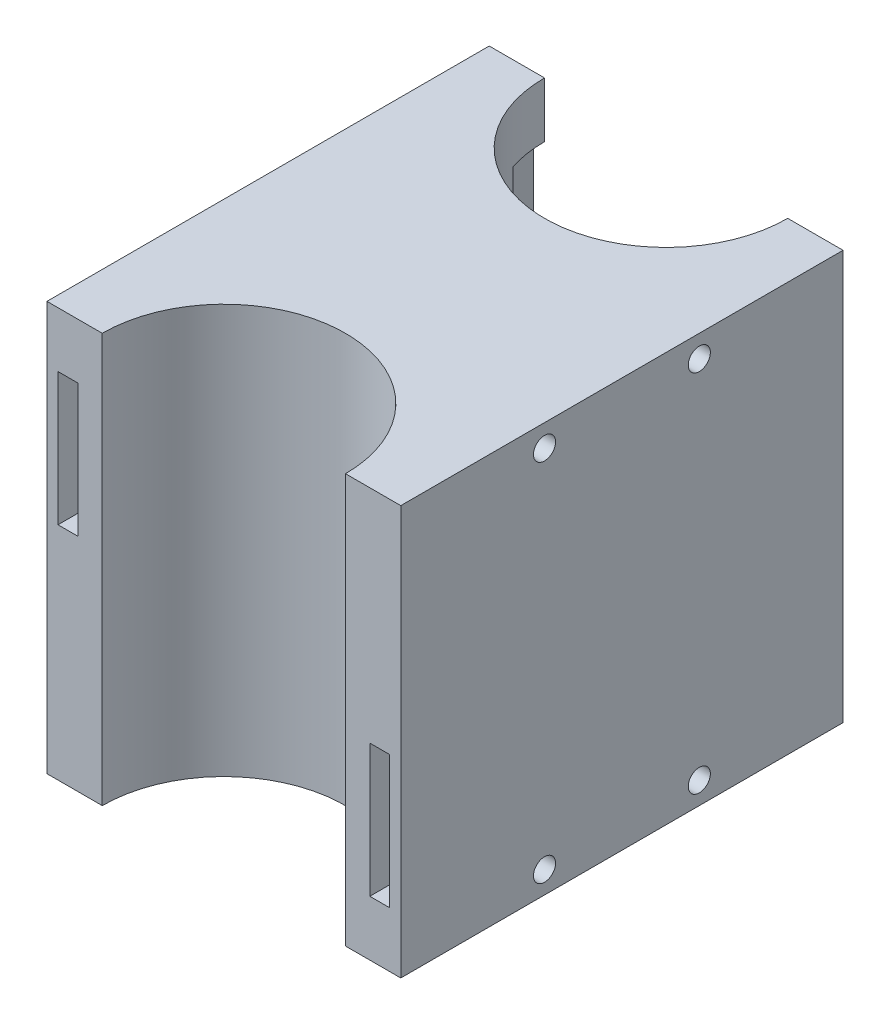
ISO-10303-21;
HEADER;
FILE_DESCRIPTION(('STEP AP214'),'2;1');
FILE_NAME('part.step','',(''),(''),'','','');
FILE_SCHEMA(('AUTOMOTIVE_DESIGN { 1 0 10303 214 1 1 1 1 }'));
ENDSEC;
DATA;
#1=APPLICATION_CONTEXT('core data for automotive mechanical design processes');
#2=APPLICATION_PROTOCOL_DEFINITION('international standard','automotive_design',2000,#1);
#3=PRODUCT_CONTEXT('',#1,'mechanical');
#4=PRODUCT('Part','Part','',(#3));
#5=PRODUCT_RELATED_PRODUCT_CATEGORY('part','',(#4));
#6=PRODUCT_DEFINITION_FORMATION('','',#4);
#7=PRODUCT_DEFINITION_CONTEXT('part definition',#1,'design');
#8=PRODUCT_DEFINITION('design','',#6,#7);
#9=PRODUCT_DEFINITION_SHAPE('','',#8);
#10=(LENGTH_UNIT() NAMED_UNIT(*) SI_UNIT(.MILLI.,.METRE.));
#11=(NAMED_UNIT(*) PLANE_ANGLE_UNIT() SI_UNIT($,.RADIAN.));
#12=(NAMED_UNIT(*) SI_UNIT($,.STERADIAN.) SOLID_ANGLE_UNIT());
#13=UNCERTAINTY_MEASURE_WITH_UNIT(LENGTH_MEASURE(1.E-05),#10,'distance_accuracy_value','');
#14=(GEOMETRIC_REPRESENTATION_CONTEXT(3) GLOBAL_UNCERTAINTY_ASSIGNED_CONTEXT((#13)) GLOBAL_UNIT_ASSIGNED_CONTEXT((#10,
#11,#12)) REPRESENTATION_CONTEXT('',''));
#15=CARTESIAN_POINT('',(0.,0.,0.));
#16=DIRECTION('',(0.,0.,1.));
#17=DIRECTION('',(1.,0.,0.));
#18=AXIS2_PLACEMENT_3D('',#15,#16,#17);
#19=CARTESIAN_POINT('',(0.,30.,-40.));
#20=DIRECTION('',(0.,-1.,0.));
#21=DIRECTION('',(0.,0.,-1.));
#22=AXIS2_PLACEMENT_3D('',#19,#20,#21);
#23=CYLINDRICAL_SURFACE('',#22,11.);
#24=DIRECTION('',(0.,-1.,0.));
#25=VECTOR('',#24,1.);
#26=CARTESIAN_POINT('',(-11.,30.,-40.));
#27=LINE('',#26,#25);
#28=CARTESIAN_POINT('',(-11.,33.5,-40.));
#29=VERTEX_POINT('',#28);
#30=CARTESIAN_POINT('',(-11.,28.5,-40.));
#31=VERTEX_POINT('',#30);
#32=EDGE_CURVE('E337',#29,#31,#27,.T.);
#33=ORIENTED_EDGE('',*,*,#32,.F.);
#34=CARTESIAN_POINT('',(0.,33.5,-40.));
#35=DIRECTION('',(0.,1.,0.));
#36=DIRECTION('',(0.,0.,1.));
#37=AXIS2_PLACEMENT_3D('',#34,#35,#36);
#38=CIRCLE('',#37,11.);
#39=CARTESIAN_POINT('',(11.,33.5,-40.));
#40=VERTEX_POINT('',#39);
#41=EDGE_CURVE('E202',#29,#40,#38,.T.);
#42=ORIENTED_EDGE('',*,*,#41,.T.);
#43=DIRECTION('',(0.,-1.,0.));
#44=VECTOR('',#43,1.);
#45=CARTESIAN_POINT('',(11.,30.,-40.));
#46=LINE('',#45,#44);
#47=CARTESIAN_POINT('',(11.,13.5,-40.));
#48=VERTEX_POINT('',#47);
#49=EDGE_CURVE('E251',#48,#40,#46,.F.);
#50=ORIENTED_EDGE('',*,*,#49,.F.);
#51=CARTESIAN_POINT('',(0.,13.5,-40.));
#52=DIRECTION('',(0.,-1.,0.));
#53=DIRECTION('',(0.,0.,-1.));
#54=AXIS2_PLACEMENT_3D('',#51,#52,#53);
#55=CIRCLE('',#54,11.);
#56=CARTESIAN_POINT('',(10.472424422504,13.5,-36.6342420296547));
#57=VERTEX_POINT('',#56);
#58=EDGE_CURVE('E43',#48,#57,#55,.T.);
#59=ORIENTED_EDGE('',*,*,#58,.T.);
#60=DIRECTION('',(0.,-1.,0.));
#61=VECTOR('',#60,1.);
#62=CARTESIAN_POINT('',(10.472424422504,30.,-36.6342420296548));
#63=LINE('',#62,#61);
#64=CARTESIAN_POINT('',(10.472424422504,1.5,-36.6342420296547));
#65=VERTEX_POINT('',#64);
#66=EDGE_CURVE('E244',#65,#57,#63,.F.);
#67=ORIENTED_EDGE('',*,*,#66,.F.);
#68=CARTESIAN_POINT('',(0.,1.5,-40.));
#69=DIRECTION('',(0.,-1.,0.));
#70=DIRECTION('',(0.,0.,-1.));
#71=AXIS2_PLACEMENT_3D('',#68,#69,#70);
#72=CIRCLE('',#71,11.);
#73=CARTESIAN_POINT('',(11.,1.5,-40.));
#74=VERTEX_POINT('',#73);
#75=EDGE_CURVE('E242',#74,#65,#72,.T.);
#76=ORIENTED_EDGE('',*,*,#75,.F.);
#77=CARTESIAN_POINT('',(11.,-3.50000000000001,-40.));
#78=VERTEX_POINT('',#77);
#79=EDGE_CURVE('E398',#78,#74,#46,.F.);
#80=ORIENTED_EDGE('',*,*,#79,.F.);
#81=CARTESIAN_POINT('',(0.,-3.50000000000001,-40.));
#82=DIRECTION('',(0.,-1.,0.));
#83=DIRECTION('',(0.,0.,-1.));
#84=AXIS2_PLACEMENT_3D('',#81,#82,#83);
#85=CIRCLE('',#84,11.);
#86=CARTESIAN_POINT('',(-11.,-3.50000000000001,-40.));
#87=VERTEX_POINT('',#86);
#88=EDGE_CURVE('E308',#78,#87,#85,.T.);
#89=ORIENTED_EDGE('',*,*,#88,.T.);
#90=CARTESIAN_POINT('',(-11.,16.5,-40.));
#91=VERTEX_POINT('',#90);
#92=EDGE_CURVE('E50',#91,#87,#27,.T.);
#93=ORIENTED_EDGE('',*,*,#92,.F.);
#94=CARTESIAN_POINT('',(0.,16.5,-40.));
#95=DIRECTION('',(0.,1.,0.));
#96=DIRECTION('',(0.,0.,1.));
#97=AXIS2_PLACEMENT_3D('',#94,#95,#96);
#98=CIRCLE('',#97,11.);
#99=CARTESIAN_POINT('',(-10.472424422504,16.5,-36.6342420296547));
#100=VERTEX_POINT('',#99);
#101=EDGE_CURVE('E240',#91,#100,#98,.T.);
#102=ORIENTED_EDGE('',*,*,#101,.T.);
#103=DIRECTION('',(0.,-1.,0.));
#104=VECTOR('',#103,1.);
#105=CARTESIAN_POINT('',(-10.472424422504,30.,-36.6342420296547));
#106=LINE('',#105,#104);
#107=CARTESIAN_POINT('',(-10.472424422504,28.5,-36.6342420296547));
#108=VERTEX_POINT('',#107);
#109=EDGE_CURVE('E237',#108,#100,#106,.T.);
#110=ORIENTED_EDGE('',*,*,#109,.F.);
#111=CARTESIAN_POINT('',(0.,28.5,-40.));
#112=DIRECTION('',(0.,1.,0.));
#113=DIRECTION('',(0.,0.,1.));
#114=AXIS2_PLACEMENT_3D('',#111,#112,#113);
#115=CIRCLE('',#114,11.);
#116=EDGE_CURVE('E232',#31,#108,#115,.T.);
#117=ORIENTED_EDGE('',*,*,#116,.F.);
#118=EDGE_LOOP('',(#33,#42,#50,#59,#67,#76,#80,#89,#93,#102,#110,#117));
#119=FACE_BOUND('',#118,.T.);
#120=ADVANCED_FACE('F35',(#119),#23,.F.);
#121=CARTESIAN_POINT('',(-16.,30.,-53.5));
#122=DIRECTION('',(1.,0.,0.));
#123=DIRECTION('',(0.,0.,-1.));
#124=AXIS2_PLACEMENT_3D('',#121,#122,#123);
#125=PLANE('',#124);
#126=CARTESIAN_POINT('',(-16.,-1.50000000000001,-13.));
#127=DIRECTION('',(1.,0.,0.));
#128=DIRECTION('',(0.,0.,-1.));
#129=AXIS2_PLACEMENT_3D('',#126,#127,#128);
#130=CIRCLE('',#129,1.);
#131=CARTESIAN_POINT('',(-16.,-1.50000000000001,-14.));
#132=VERTEX_POINT('',#131);
#133=EDGE_CURVE('E362',#132,#132,#130,.T.);
#134=ORIENTED_EDGE('',*,*,#133,.T.);
#135=EDGE_LOOP('',(#134));
#136=FACE_BOUND('',#135,.T.);
#137=CARTESIAN_POINT('',(-16.,-1.50000000000001,-27.));
#138=DIRECTION('',(1.,0.,0.));
#139=DIRECTION('',(0.,0.,-1.));
#140=AXIS2_PLACEMENT_3D('',#137,#138,#139);
#141=CIRCLE('',#140,1.);
#142=CARTESIAN_POINT('',(-16.,-1.50000000000001,-28.));
#143=VERTEX_POINT('',#142);
#144=EDGE_CURVE('E368',#143,#143,#141,.T.);
#145=ORIENTED_EDGE('',*,*,#144,.T.);
#146=EDGE_LOOP('',(#145));
#147=FACE_BOUND('',#146,.T.);
#148=CARTESIAN_POINT('',(-16.,31.5,-27.));
#149=DIRECTION('',(1.,0.,0.));
#150=DIRECTION('',(0.,0.,-1.));
#151=AXIS2_PLACEMENT_3D('',#148,#149,#150);
#152=CIRCLE('',#151,1.);
#153=CARTESIAN_POINT('',(-16.,31.5,-28.));
#154=VERTEX_POINT('',#153);
#155=EDGE_CURVE('E374',#154,#154,#152,.T.);
#156=ORIENTED_EDGE('',*,*,#155,.T.);
#157=EDGE_LOOP('',(#156));
#158=FACE_BOUND('',#157,.T.);
#159=CARTESIAN_POINT('',(-16.,31.5,-13.));
#160=DIRECTION('',(1.,0.,0.));
#161=DIRECTION('',(0.,0.,-1.));
#162=AXIS2_PLACEMENT_3D('',#159,#160,#161);
#163=CIRCLE('',#162,1.);
#164=CARTESIAN_POINT('',(-16.,31.5,-14.));
#165=VERTEX_POINT('',#164);
#166=EDGE_CURVE('E380',#165,#165,#163,.T.);
#167=ORIENTED_EDGE('',*,*,#166,.T.);
#168=EDGE_LOOP('',(#167));
#169=FACE_BOUND('',#168,.T.);
#170=DIRECTION('',(0.,0.,1.));
#171=VECTOR('',#170,1.);
#172=CARTESIAN_POINT('',(-16.,33.5,-53.5));
#173=LINE('',#172,#171);
#174=CARTESIAN_POINT('',(-16.,33.5,-40.));
#175=VERTEX_POINT('',#174);
#176=CARTESIAN_POINT('',(-16.,33.5,0.));
#177=VERTEX_POINT('',#176);
#178=EDGE_CURVE('E198',#175,#177,#173,.T.);
#179=ORIENTED_EDGE('',*,*,#178,.F.);
#180=DIRECTION('',(0.,-1.,0.));
#181=VECTOR('',#180,1.);
#182=CARTESIAN_POINT('',(-16.,-3.50000000000001,-40.));
#183=LINE('',#182,#181);
#184=CARTESIAN_POINT('',(-16.,-3.50000000000001,-40.));
#185=VERTEX_POINT('',#184);
#186=EDGE_CURVE('E182',#175,#185,#183,.T.);
#187=ORIENTED_EDGE('',*,*,#186,.T.);
#188=DIRECTION('',(0.,0.,-1.));
#189=VECTOR('',#188,1.);
#190=CARTESIAN_POINT('',(-16.,-3.50000000000001,-26.5));
#191=LINE('',#190,#189);
#192=CARTESIAN_POINT('',(-16.,-3.50000000000001,0.));
#193=VERTEX_POINT('',#192);
#194=EDGE_CURVE('E311',#193,#185,#191,.T.);
#195=ORIENTED_EDGE('',*,*,#194,.F.);
#196=DIRECTION('',(0.,1.,0.));
#197=VECTOR('',#196,1.);
#198=CARTESIAN_POINT('',(-16.,33.5,0.));
#199=LINE('',#198,#197);
#200=EDGE_CURVE('E206',#193,#177,#199,.T.);
#201=ORIENTED_EDGE('',*,*,#200,.T.);
#202=EDGE_LOOP('',(#179,#187,#195,#201));
#203=FACE_BOUND('',#202,.T.);
#204=ADVANCED_FACE('F37',(#136,#147,#158,#169,#203),#125,.F.);
#205=CARTESIAN_POINT('',(16.,30.,-53.5));
#206=DIRECTION('',(-1.,0.,0.));
#207=DIRECTION('',(0.,0.,1.));
#208=AXIS2_PLACEMENT_3D('',#205,#206,#207);
#209=PLANE('',#208);
#210=CARTESIAN_POINT('',(16.,-1.50000000000001,-13.));
#211=DIRECTION('',(1.,0.,0.));
#212=DIRECTION('',(0.,0.,-1.));
#213=AXIS2_PLACEMENT_3D('',#210,#211,#212);
#214=CIRCLE('',#213,1.);
#215=CARTESIAN_POINT('',(16.,-1.50000000000001,-14.));
#216=VERTEX_POINT('',#215);
#217=EDGE_CURVE('E361',#216,#216,#214,.T.);
#218=ORIENTED_EDGE('',*,*,#217,.F.);
#219=EDGE_LOOP('',(#218));
#220=FACE_BOUND('',#219,.T.);
#221=CARTESIAN_POINT('',(16.,-1.50000000000001,-27.));
#222=DIRECTION('',(1.,0.,0.));
#223=DIRECTION('',(0.,0.,-1.));
#224=AXIS2_PLACEMENT_3D('',#221,#222,#223);
#225=CIRCLE('',#224,1.);
#226=CARTESIAN_POINT('',(16.,-1.50000000000001,-28.));
#227=VERTEX_POINT('',#226);
#228=EDGE_CURVE('E365',#227,#227,#225,.T.);
#229=ORIENTED_EDGE('',*,*,#228,.F.);
#230=EDGE_LOOP('',(#229));
#231=FACE_BOUND('',#230,.T.);
#232=CARTESIAN_POINT('',(16.,31.5,-27.));
#233=DIRECTION('',(1.,0.,0.));
#234=DIRECTION('',(0.,0.,-1.));
#235=AXIS2_PLACEMENT_3D('',#232,#233,#234);
#236=CIRCLE('',#235,1.);
#237=CARTESIAN_POINT('',(16.,31.5,-28.));
#238=VERTEX_POINT('',#237);
#239=EDGE_CURVE('E371',#238,#238,#236,.T.);
#240=ORIENTED_EDGE('',*,*,#239,.F.);
#241=EDGE_LOOP('',(#240));
#242=FACE_BOUND('',#241,.T.);
#243=CARTESIAN_POINT('',(16.,31.5,-13.));
#244=DIRECTION('',(1.,0.,0.));
#245=DIRECTION('',(0.,0.,-1.));
#246=AXIS2_PLACEMENT_3D('',#243,#244,#245);
#247=CIRCLE('',#246,1.);
#248=CARTESIAN_POINT('',(16.,31.5,-14.));
#249=VERTEX_POINT('',#248);
#250=EDGE_CURVE('E377',#249,#249,#247,.T.);
#251=ORIENTED_EDGE('',*,*,#250,.F.);
#252=EDGE_LOOP('',(#251));
#253=FACE_BOUND('',#252,.T.);
#254=DIRECTION('',(0.,0.,1.));
#255=VECTOR('',#254,1.);
#256=CARTESIAN_POINT('',(16.,-3.50000000000001,-53.5));
#257=LINE('',#256,#255);
#258=CARTESIAN_POINT('',(16.,-3.50000000000001,-40.));
#259=VERTEX_POINT('',#258);
#260=CARTESIAN_POINT('',(16.,-3.50000000000001,0.));
#261=VERTEX_POINT('',#260);
#262=EDGE_CURVE('E212',#259,#261,#257,.T.);
#263=ORIENTED_EDGE('',*,*,#262,.F.);
#264=DIRECTION('',(0.,-1.,0.));
#265=VECTOR('',#264,1.);
#266=CARTESIAN_POINT('',(16.,-3.50000000000001,-40.));
#267=LINE('',#266,#265);
#268=CARTESIAN_POINT('',(16.,33.5,-40.));
#269=VERTEX_POINT('',#268);
#270=EDGE_CURVE('E58',#269,#259,#267,.T.);
#271=ORIENTED_EDGE('',*,*,#270,.F.);
#272=DIRECTION('',(0.,0.,-1.));
#273=VECTOR('',#272,1.);
#274=CARTESIAN_POINT('',(16.,33.5,-26.5));
#275=LINE('',#274,#273);
#276=CARTESIAN_POINT('',(16.,33.5,0.));
#277=VERTEX_POINT('',#276);
#278=EDGE_CURVE('E207',#277,#269,#275,.T.);
#279=ORIENTED_EDGE('',*,*,#278,.F.);
#280=DIRECTION('',(0.,1.,0.));
#281=VECTOR('',#280,1.);
#282=CARTESIAN_POINT('',(16.,33.5,0.));
#283=LINE('',#282,#281);
#284=EDGE_CURVE('E327',#261,#277,#283,.T.);
#285=ORIENTED_EDGE('',*,*,#284,.F.);
#286=EDGE_LOOP('',(#263,#271,#279,#285));
#287=FACE_BOUND('',#286,.T.);
#288=ADVANCED_FACE('F332',(#220,#231,#242,#253,#287),#209,.F.);
#289=CARTESIAN_POINT('',(24.9601132838557,16.5,-24.7141258886984));
#290=DIRECTION('',(0.,1.,0.));
#291=DIRECTION('',(0.,0.,1.));
#292=AXIS2_PLACEMENT_3D('',#289,#290,#291);
#293=CYLINDRICAL_SURFACE('',#292,40.);
#294=CARTESIAN_POINT('',(24.9601132838557,16.5,-24.7141258886984));
#295=DIRECTION('',(0.,1.,0.));
#296=DIRECTION('',(0.,0.,1.));
#297=AXIS2_PLACEMENT_3D('',#294,#295,#296);
#298=CIRCLE('',#297,40.);
#299=CARTESIAN_POINT('',(-12.0039510577915,16.5,-40.));
#300=VERTEX_POINT('',#299);
#301=CARTESIAN_POINT('',(-15.,16.5,-26.5));
#302=VERTEX_POINT('',#301);
#303=EDGE_CURVE('E226',#300,#302,#298,.T.);
#304=ORIENTED_EDGE('',*,*,#303,.F.);
#305=DIRECTION('',(0.,1.,0.));
#306=VECTOR('',#305,1.);
#307=CARTESIAN_POINT('',(-12.0039510577915,16.5,-40.));
#308=LINE('',#307,#306);
#309=CARTESIAN_POINT('',(-12.0039510577915,28.5,-40.));
#310=VERTEX_POINT('',#309);
#311=EDGE_CURVE('E408',#300,#310,#308,.T.);
#312=ORIENTED_EDGE('',*,*,#311,.T.);
#313=CARTESIAN_POINT('',(24.9601132838557,28.5,-24.7141258886984));
#314=DIRECTION('',(0.,1.,0.));
#315=DIRECTION('',(0.,0.,1.));
#316=AXIS2_PLACEMENT_3D('',#313,#314,#315);
#317=CIRCLE('',#316,40.);
#318=CARTESIAN_POINT('',(-15.,28.5,-26.5));
#319=VERTEX_POINT('',#318);
#320=EDGE_CURVE('E222',#310,#319,#317,.T.);
#321=ORIENTED_EDGE('',*,*,#320,.T.);
#322=DIRECTION('',(0.,1.,0.));
#323=VECTOR('',#322,1.);
#324=CARTESIAN_POINT('',(-15.,28.5,-26.5));
#325=LINE('',#324,#323);
#326=EDGE_CURVE('E275',#302,#319,#325,.T.);
#327=ORIENTED_EDGE('',*,*,#326,.F.);
#328=EDGE_LOOP('',(#304,#312,#321,#327));
#329=FACE_BOUND('',#328,.T.);
#330=ADVANCED_FACE('F422',(#329),#293,.F.);
#331=CARTESIAN_POINT('',(-13.2,16.5,-26.5));
#332=DIRECTION('',(0.965636665998328,0.,0.259895804659548));
#333=DIRECTION('',(0.259895804659548,0.,-0.965636665998328));
#334=AXIS2_PLACEMENT_3D('',#331,#332,#333);
#335=PLANE('',#334);
#336=ORIENTED_EDGE('',*,*,#109,.T.);
#337=DIRECTION('',(0.259895804659548,0.,-0.965636665998328));
#338=VECTOR('',#337,1.);
#339=CARTESIAN_POINT('',(-13.2,16.5,-26.5));
#340=LINE('',#339,#338);
#341=CARTESIAN_POINT('',(-13.2,16.5,-26.5));
#342=VERTEX_POINT('',#341);
#343=EDGE_CURVE('E228',#342,#100,#340,.T.);
#344=ORIENTED_EDGE('',*,*,#343,.F.);
#345=DIRECTION('',(0.,-1.,0.));
#346=VECTOR('',#345,1.);
#347=CARTESIAN_POINT('',(-13.2,16.5,-26.5));
#348=LINE('',#347,#346);
#349=CARTESIAN_POINT('',(-13.2,28.5,-26.5));
#350=VERTEX_POINT('',#349);
#351=EDGE_CURVE('E279',#350,#342,#348,.T.);
#352=ORIENTED_EDGE('',*,*,#351,.F.);
#353=DIRECTION('',(0.259895804659548,0.,-0.965636665998328));
#354=VECTOR('',#353,1.);
#355=CARTESIAN_POINT('',(-13.2,28.5,-26.5));
#356=LINE('',#355,#354);
#357=EDGE_CURVE('E229',#350,#108,#356,.T.);
#358=ORIENTED_EDGE('',*,*,#357,.T.);
#359=EDGE_LOOP('',(#336,#344,#352,#358));
#360=FACE_BOUND('',#359,.T.);
#361=ADVANCED_FACE('F433',(#360),#335,.F.);
#362=CARTESIAN_POINT('',(24.9601132838557,16.5,-24.7141258886984));
#363=DIRECTION('',(0.,1.,0.));
#364=DIRECTION('',(0.,0.,1.));
#365=AXIS2_PLACEMENT_3D('',#362,#363,#364);
#366=PLANE('',#365);
#367=DIRECTION('',(1.,0.,0.));
#368=VECTOR('',#367,1.);
#369=CARTESIAN_POINT('',(24.9601132838557,16.5,-40.));
#370=LINE('',#369,#368);
#371=EDGE_CURVE('E335',#300,#91,#370,.T.);
#372=ORIENTED_EDGE('',*,*,#371,.F.);
#373=ORIENTED_EDGE('',*,*,#303,.T.);
#374=DIRECTION('',(0.,0.,1.));
#375=VECTOR('',#374,1.);
#376=CARTESIAN_POINT('',(-15.,16.5,-13.5));
#377=LINE('',#376,#375);
#378=CARTESIAN_POINT('',(-15.,16.5,0.));
#379=VERTEX_POINT('',#378);
#380=EDGE_CURVE('E268',#302,#379,#377,.T.);
#381=ORIENTED_EDGE('',*,*,#380,.T.);
#382=DIRECTION('',(-1.,0.,0.));
#383=VECTOR('',#382,1.);
#384=CARTESIAN_POINT('',(24.9601132838557,16.5,0.));
#385=LINE('',#384,#383);
#386=CARTESIAN_POINT('',(-13.2,16.5,0.));
#387=VERTEX_POINT('',#386);
#388=EDGE_CURVE('E356',#387,#379,#385,.T.);
#389=ORIENTED_EDGE('',*,*,#388,.F.);
#390=DIRECTION('',(0.,0.,1.));
#391=VECTOR('',#390,1.);
#392=CARTESIAN_POINT('',(-13.2,16.5,-13.5));
#393=LINE('',#392,#391);
#394=EDGE_CURVE('E300',#342,#387,#393,.T.);
#395=ORIENTED_EDGE('',*,*,#394,.F.);
#396=ORIENTED_EDGE('',*,*,#343,.T.);
#397=ORIENTED_EDGE('',*,*,#101,.F.);
#398=EDGE_LOOP('',(#372,#373,#381,#389,#395,#396,#397));
#399=FACE_BOUND('',#398,.T.);
#400=ADVANCED_FACE('F418',(#399),#366,.T.);
#401=CARTESIAN_POINT('',(24.9601132838557,28.5,-24.7141258886984));
#402=DIRECTION('',(0.,1.,0.));
#403=DIRECTION('',(0.,0.,1.));
#404=AXIS2_PLACEMENT_3D('',#401,#402,#403);
#405=PLANE('',#404);
#406=ORIENTED_EDGE('',*,*,#320,.F.);
#407=DIRECTION('',(1.,0.,0.));
#408=VECTOR('',#407,1.);
#409=CARTESIAN_POINT('',(24.9601132838557,28.5,-40.));
#410=LINE('',#409,#408);
#411=EDGE_CURVE('E406',#310,#31,#410,.T.);
#412=ORIENTED_EDGE('',*,*,#411,.T.);
#413=ORIENTED_EDGE('',*,*,#116,.T.);
#414=ORIENTED_EDGE('',*,*,#357,.F.);
#415=DIRECTION('',(0.,0.,1.));
#416=VECTOR('',#415,1.);
#417=CARTESIAN_POINT('',(-13.2,28.5,-13.5));
#418=LINE('',#417,#416);
#419=CARTESIAN_POINT('',(-13.2,28.5,0.));
#420=VERTEX_POINT('',#419);
#421=EDGE_CURVE('E297',#350,#420,#418,.T.);
#422=ORIENTED_EDGE('',*,*,#421,.T.);
#423=DIRECTION('',(-1.,0.,0.));
#424=VECTOR('',#423,1.);
#425=CARTESIAN_POINT('',(24.9601132838557,28.5,0.));
#426=LINE('',#425,#424);
#427=CARTESIAN_POINT('',(-15.,28.5,0.));
#428=VERTEX_POINT('',#427);
#429=EDGE_CURVE('E353',#420,#428,#426,.T.);
#430=ORIENTED_EDGE('',*,*,#429,.T.);
#431=DIRECTION('',(0.,0.,1.));
#432=VECTOR('',#431,1.);
#433=CARTESIAN_POINT('',(-15.,28.5,-13.5));
#434=LINE('',#433,#432);
#435=EDGE_CURVE('E293',#319,#428,#434,.T.);
#436=ORIENTED_EDGE('',*,*,#435,.F.);
#437=EDGE_LOOP('',(#406,#412,#413,#414,#422,#430,#436));
#438=FACE_BOUND('',#437,.T.);
#439=ADVANCED_FACE('F435',(#438),#405,.F.);
#440=CARTESIAN_POINT('',(-24.9601132838557,13.5,-24.7141258886984));
#441=DIRECTION('',(0.,-1.,0.));
#442=DIRECTION('',(0.,0.,-1.));
#443=AXIS2_PLACEMENT_3D('',#440,#441,#442);
#444=CYLINDRICAL_SURFACE('',#443,40.);
#445=CARTESIAN_POINT('',(-24.9601132838557,13.5,-24.7141258886984));
#446=DIRECTION('',(0.,-1.,0.));
#447=DIRECTION('',(0.,0.,1.));
#448=AXIS2_PLACEMENT_3D('',#445,#446,#447);
#449=CIRCLE('',#448,40.);
#450=CARTESIAN_POINT('',(12.0039510577915,13.5,-40.));
#451=VERTEX_POINT('',#450);
#452=CARTESIAN_POINT('',(15.,13.5,-26.5));
#453=VERTEX_POINT('',#452);
#454=EDGE_CURVE('E216',#451,#453,#449,.T.);
#455=ORIENTED_EDGE('',*,*,#454,.F.);
#456=DIRECTION('',(0.,-1.,0.));
#457=VECTOR('',#456,1.);
#458=CARTESIAN_POINT('',(12.0039510577915,13.5,-40.));
#459=LINE('',#458,#457);
#460=CARTESIAN_POINT('',(12.0039510577915,1.5,-40.));
#461=VERTEX_POINT('',#460);
#462=EDGE_CURVE('E401',#451,#461,#459,.T.);
#463=ORIENTED_EDGE('',*,*,#462,.T.);
#464=CARTESIAN_POINT('',(-24.9601132838557,1.5,-24.7141258886984));
#465=DIRECTION('',(0.,-1.,0.));
#466=DIRECTION('',(0.,0.,1.));
#467=AXIS2_PLACEMENT_3D('',#464,#465,#466);
#468=CIRCLE('',#467,40.);
#469=CARTESIAN_POINT('',(15.,1.5,-26.5));
#470=VERTEX_POINT('',#469);
#471=EDGE_CURVE('E210',#461,#470,#468,.T.);
#472=ORIENTED_EDGE('',*,*,#471,.T.);
#473=DIRECTION('',(0.,-1.,0.));
#474=VECTOR('',#473,1.);
#475=CARTESIAN_POINT('',(15.,1.5,-26.5));
#476=LINE('',#475,#474);
#477=EDGE_CURVE('E276',#453,#470,#476,.T.);
#478=ORIENTED_EDGE('',*,*,#477,.F.);
#479=EDGE_LOOP('',(#455,#463,#472,#478));
#480=FACE_BOUND('',#479,.T.);
#481=ADVANCED_FACE('F708',(#480),#444,.F.);
#482=CARTESIAN_POINT('',(13.2,13.5,-26.5));
#483=DIRECTION('',(-0.965636665998328,0.,0.259895804659549));
#484=DIRECTION('',(0.259895804659549,0.,0.965636665998328));
#485=AXIS2_PLACEMENT_3D('',#482,#483,#484);
#486=PLANE('',#485);
#487=ORIENTED_EDGE('',*,*,#66,.T.);
#488=DIRECTION('',(-0.259895804659549,0.,-0.965636665998328));
#489=VECTOR('',#488,1.);
#490=CARTESIAN_POINT('',(13.2,13.5,-26.5));
#491=LINE('',#490,#489);
#492=CARTESIAN_POINT('',(13.2,13.5,-26.5));
#493=VERTEX_POINT('',#492);
#494=EDGE_CURVE('E218',#493,#57,#491,.T.);
#495=ORIENTED_EDGE('',*,*,#494,.F.);
#496=DIRECTION('',(0.,1.,0.));
#497=VECTOR('',#496,1.);
#498=CARTESIAN_POINT('',(13.2,13.5,-26.5));
#499=LINE('',#498,#497);
#500=CARTESIAN_POINT('',(13.2,1.5,-26.5));
#501=VERTEX_POINT('',#500);
#502=EDGE_CURVE('E271',#501,#493,#499,.T.);
#503=ORIENTED_EDGE('',*,*,#502,.F.);
#504=DIRECTION('',(-0.259895804659549,0.,-0.965636665998328));
#505=VECTOR('',#504,1.);
#506=CARTESIAN_POINT('',(13.2,1.5,-26.5));
#507=LINE('',#506,#505);
#508=EDGE_CURVE('E219',#501,#65,#507,.T.);
#509=ORIENTED_EDGE('',*,*,#508,.T.);
#510=EDGE_LOOP('',(#487,#495,#503,#509));
#511=FACE_BOUND('',#510,.T.);
#512=ADVANCED_FACE('F256',(#511),#486,.F.);
#513=CARTESIAN_POINT('',(-24.9601132838557,13.5,-24.7141258886984));
#514=DIRECTION('',(0.,-1.,0.));
#515=DIRECTION('',(0.,0.,1.));
#516=AXIS2_PLACEMENT_3D('',#513,#514,#515);
#517=PLANE('',#516);
#518=DIRECTION('',(-1.,0.,0.));
#519=VECTOR('',#518,1.);
#520=CARTESIAN_POINT('',(-24.9601132838557,13.5,-40.));
#521=LINE('',#520,#519);
#522=EDGE_CURVE('E400',#451,#48,#521,.T.);
#523=ORIENTED_EDGE('',*,*,#522,.F.);
#524=ORIENTED_EDGE('',*,*,#454,.T.);
#525=DIRECTION('',(0.,0.,1.));
#526=VECTOR('',#525,1.);
#527=CARTESIAN_POINT('',(15.,13.5,-13.5));
#528=LINE('',#527,#526);
#529=CARTESIAN_POINT('',(15.,13.5,0.));
#530=VERTEX_POINT('',#529);
#531=EDGE_CURVE('E269',#453,#530,#528,.T.);
#532=ORIENTED_EDGE('',*,*,#531,.T.);
#533=DIRECTION('',(1.,0.,0.));
#534=VECTOR('',#533,1.);
#535=CARTESIAN_POINT('',(-24.9601132838557,13.5,0.));
#536=LINE('',#535,#534);
#537=CARTESIAN_POINT('',(13.2,13.5,0.));
#538=VERTEX_POINT('',#537);
#539=EDGE_CURVE('E265',#538,#530,#536,.T.);
#540=ORIENTED_EDGE('',*,*,#539,.F.);
#541=DIRECTION('',(0.,0.,1.));
#542=VECTOR('',#541,1.);
#543=CARTESIAN_POINT('',(13.2,13.5,-13.5));
#544=LINE('',#543,#542);
#545=EDGE_CURVE('E262',#493,#538,#544,.T.);
#546=ORIENTED_EDGE('',*,*,#545,.F.);
#547=ORIENTED_EDGE('',*,*,#494,.T.);
#548=ORIENTED_EDGE('',*,*,#58,.F.);
#549=EDGE_LOOP('',(#523,#524,#532,#540,#546,#547,#548));
#550=FACE_BOUND('',#549,.T.);
#551=ADVANCED_FACE('F259',(#550),#517,.T.);
#552=CARTESIAN_POINT('',(-24.9601132838557,1.5,-24.7141258886984));
#553=DIRECTION('',(0.,-1.,0.));
#554=DIRECTION('',(0.,0.,1.));
#555=AXIS2_PLACEMENT_3D('',#552,#553,#554);
#556=PLANE('',#555);
#557=ORIENTED_EDGE('',*,*,#471,.F.);
#558=DIRECTION('',(-1.,0.,0.));
#559=VECTOR('',#558,1.);
#560=CARTESIAN_POINT('',(-24.9601132838557,1.5,-40.));
#561=LINE('',#560,#559);
#562=EDGE_CURVE('E394',#461,#74,#561,.T.);
#563=ORIENTED_EDGE('',*,*,#562,.T.);
#564=ORIENTED_EDGE('',*,*,#75,.T.);
#565=ORIENTED_EDGE('',*,*,#508,.F.);
#566=DIRECTION('',(0.,0.,1.));
#567=VECTOR('',#566,1.);
#568=CARTESIAN_POINT('',(13.2,1.5,-13.5));
#569=LINE('',#568,#567);
#570=CARTESIAN_POINT('',(13.2,1.5,0.));
#571=VERTEX_POINT('',#570);
#572=EDGE_CURVE('E274',#501,#571,#569,.T.);
#573=ORIENTED_EDGE('',*,*,#572,.T.);
#574=DIRECTION('',(1.,0.,0.));
#575=VECTOR('',#574,1.);
#576=CARTESIAN_POINT('',(-24.9601132838557,1.5,0.));
#577=LINE('',#576,#575);
#578=CARTESIAN_POINT('',(15.,1.5,0.));
#579=VERTEX_POINT('',#578);
#580=EDGE_CURVE('E341',#571,#579,#577,.T.);
#581=ORIENTED_EDGE('',*,*,#580,.T.);
#582=DIRECTION('',(0.,0.,1.));
#583=VECTOR('',#582,1.);
#584=CARTESIAN_POINT('',(15.,1.5,-13.5));
#585=LINE('',#584,#583);
#586=EDGE_CURVE('E289',#470,#579,#585,.T.);
#587=ORIENTED_EDGE('',*,*,#586,.F.);
#588=EDGE_LOOP('',(#557,#563,#564,#565,#573,#581,#587));
#589=FACE_BOUND('',#588,.T.);
#590=ADVANCED_FACE('F594',(#589),#556,.F.);
#591=CARTESIAN_POINT('',(0.,33.5,-40.));
#592=DIRECTION('',(0.,1.,0.));
#593=DIRECTION('',(0.,0.,1.));
#594=AXIS2_PLACEMENT_3D('',#591,#592,#593);
#595=PLANE('',#594);
#596=DIRECTION('',(1.,0.,0.));
#597=VECTOR('',#596,1.);
#598=CARTESIAN_POINT('',(-16.,33.5,-40.));
#599=LINE('',#598,#597);
#600=EDGE_CURVE('E185',#175,#29,#599,.T.);
#601=ORIENTED_EDGE('',*,*,#600,.F.);
#602=ORIENTED_EDGE('',*,*,#178,.T.);
#603=DIRECTION('',(1.,0.,0.));
#604=VECTOR('',#603,1.);
#605=CARTESIAN_POINT('',(-16.,33.5,0.));
#606=LINE('',#605,#604);
#607=CARTESIAN_POINT('',(-11.,33.5,0.));
#608=VERTEX_POINT('',#607);
#609=EDGE_CURVE('E340',#177,#608,#606,.T.);
#610=ORIENTED_EDGE('',*,*,#609,.T.);
#611=CARTESIAN_POINT('',(0.,33.5,0.));
#612=DIRECTION('',(0.,1.,0.));
#613=DIRECTION('',(0.,0.,1.));
#614=AXIS2_PLACEMENT_3D('',#611,#612,#613);
#615=CIRCLE('',#614,11.);
#616=CARTESIAN_POINT('',(11.,33.5,0.));
#617=VERTEX_POINT('',#616);
#618=EDGE_CURVE('E282',#617,#608,#615,.T.);
#619=ORIENTED_EDGE('',*,*,#618,.F.);
#620=EDGE_CURVE('E342',#617,#277,#606,.T.);
#621=ORIENTED_EDGE('',*,*,#620,.T.);
#622=ORIENTED_EDGE('',*,*,#278,.T.);
#623=EDGE_CURVE('E192',#40,#269,#599,.T.);
#624=ORIENTED_EDGE('',*,*,#623,.F.);
#625=ORIENTED_EDGE('',*,*,#41,.F.);
#626=EDGE_LOOP('',(#601,#602,#610,#619,#621,#622,#624,#625));
#627=FACE_BOUND('',#626,.T.);
#628=ADVANCED_FACE('F196',(#627),#595,.T.);
#629=CARTESIAN_POINT('',(0.,-3.50000000000001,-40.));
#630=DIRECTION('',(0.,-1.,0.));
#631=DIRECTION('',(0.,0.,-1.));
#632=AXIS2_PLACEMENT_3D('',#629,#630,#631);
#633=PLANE('',#632);
#634=DIRECTION('',(1.,0.,0.));
#635=VECTOR('',#634,1.);
#636=CARTESIAN_POINT('',(-16.,-3.50000000000001,-40.));
#637=LINE('',#636,#635);
#638=EDGE_CURVE('E203',#78,#259,#637,.T.);
#639=ORIENTED_EDGE('',*,*,#638,.T.);
#640=ORIENTED_EDGE('',*,*,#262,.T.);
#641=DIRECTION('',(1.,0.,0.));
#642=VECTOR('',#641,1.);
#643=CARTESIAN_POINT('',(-16.,-3.50000000000001,0.));
#644=LINE('',#643,#642);
#645=CARTESIAN_POINT('',(11.,-3.50000000000001,0.));
#646=VERTEX_POINT('',#645);
#647=EDGE_CURVE('E318',#646,#261,#644,.T.);
#648=ORIENTED_EDGE('',*,*,#647,.F.);
#649=CARTESIAN_POINT('',(0.,-3.5,0.));
#650=DIRECTION('',(0.,-1.,0.));
#651=DIRECTION('',(0.,0.,-1.));
#652=AXIS2_PLACEMENT_3D('',#649,#650,#651);
#653=CIRCLE('',#652,11.);
#654=CARTESIAN_POINT('',(-11.,-3.50000000000001,0.));
#655=VERTEX_POINT('',#654);
#656=EDGE_CURVE('E383',#655,#646,#653,.T.);
#657=ORIENTED_EDGE('',*,*,#656,.F.);
#658=EDGE_CURVE('E329',#193,#655,#644,.T.);
#659=ORIENTED_EDGE('',*,*,#658,.F.);
#660=ORIENTED_EDGE('',*,*,#194,.T.);
#661=EDGE_CURVE('E187',#185,#87,#637,.T.);
#662=ORIENTED_EDGE('',*,*,#661,.T.);
#663=ORIENTED_EDGE('',*,*,#88,.F.);
#664=EDGE_LOOP('',(#639,#640,#648,#657,#659,#660,#662,#663));
#665=FACE_BOUND('',#664,.T.);
#666=ADVANCED_FACE('F316',(#665),#633,.T.);
#667=CARTESIAN_POINT('',(0.,30.,0.));
#668=DIRECTION('',(0.,-1.,0.));
#669=DIRECTION('',(0.,0.,-1.));
#670=AXIS2_PLACEMENT_3D('',#667,#668,#669);
#671=CYLINDRICAL_SURFACE('',#670,11.);
#672=DIRECTION('',(0.,-1.,0.));
#673=VECTOR('',#672,1.);
#674=CARTESIAN_POINT('',(11.,30.,0.));
#675=LINE('',#674,#673);
#676=EDGE_CURVE('E306',#646,#617,#675,.F.);
#677=ORIENTED_EDGE('',*,*,#676,.T.);
#678=ORIENTED_EDGE('',*,*,#618,.T.);
#679=DIRECTION('',(0.,-1.,0.));
#680=VECTOR('',#679,1.);
#681=CARTESIAN_POINT('',(-11.,30.,0.));
#682=LINE('',#681,#680);
#683=EDGE_CURVE('E296',#655,#608,#682,.F.);
#684=ORIENTED_EDGE('',*,*,#683,.F.);
#685=ORIENTED_EDGE('',*,*,#656,.T.);
#686=EDGE_LOOP('',(#677,#678,#684,#685));
#687=FACE_BOUND('',#686,.T.);
#688=ADVANCED_FACE('F389',(#687),#671,.F.);
#689=CARTESIAN_POINT('',(0.,0.,0.));
#690=DIRECTION('',(0.,0.,-1.));
#691=DIRECTION('',(-1.,0.,0.));
#692=AXIS2_PLACEMENT_3D('',#689,#690,#691);
#693=PLANE('',#692);
#694=ORIENTED_EDGE('',*,*,#683,.T.);
#695=ORIENTED_EDGE('',*,*,#609,.F.);
#696=ORIENTED_EDGE('',*,*,#200,.F.);
#697=ORIENTED_EDGE('',*,*,#658,.T.);
#698=EDGE_LOOP('',(#694,#695,#696,#697));
#699=FACE_BOUND('',#698,.T.);
#700=ORIENTED_EDGE('',*,*,#429,.F.);
#701=DIRECTION('',(0.,1.,0.));
#702=VECTOR('',#701,1.);
#703=CARTESIAN_POINT('',(-13.2,28.5,0.));
#704=LINE('',#703,#702);
#705=EDGE_CURVE('E350',#387,#420,#704,.T.);
#706=ORIENTED_EDGE('',*,*,#705,.F.);
#707=ORIENTED_EDGE('',*,*,#388,.T.);
#708=DIRECTION('',(0.,-1.,0.));
#709=VECTOR('',#708,1.);
#710=CARTESIAN_POINT('',(-15.,28.5,0.));
#711=LINE('',#710,#709);
#712=EDGE_CURVE('E358',#428,#379,#711,.T.);
#713=ORIENTED_EDGE('',*,*,#712,.F.);
#714=EDGE_LOOP('',(#700,#706,#707,#713));
#715=FACE_BOUND('',#714,.T.);
#716=ADVANCED_FACE('F391',(#699,#715),#693,.F.);
#717=CARTESIAN_POINT('',(0.,0.,0.));
#718=DIRECTION('',(0.,0.,1.));
#719=DIRECTION('',(1.,0.,0.));
#720=AXIS2_PLACEMENT_3D('',#717,#718,#719);
#721=PLANE('',#720);
#722=ORIENTED_EDGE('',*,*,#620,.F.);
#723=ORIENTED_EDGE('',*,*,#676,.F.);
#724=ORIENTED_EDGE('',*,*,#647,.T.);
#725=ORIENTED_EDGE('',*,*,#284,.T.);
#726=EDGE_LOOP('',(#722,#723,#724,#725));
#727=FACE_BOUND('',#726,.T.);
#728=ORIENTED_EDGE('',*,*,#539,.T.);
#729=DIRECTION('',(0.,1.,0.));
#730=VECTOR('',#729,1.);
#731=CARTESIAN_POINT('',(15.,13.5,0.));
#732=LINE('',#731,#730);
#733=EDGE_CURVE('E11',#579,#530,#732,.T.);
#734=ORIENTED_EDGE('',*,*,#733,.F.);
#735=ORIENTED_EDGE('',*,*,#580,.F.);
#736=DIRECTION('',(0.,-1.,0.));
#737=VECTOR('',#736,1.);
#738=CARTESIAN_POINT('',(13.2,13.5,0.));
#739=LINE('',#738,#737);
#740=EDGE_CURVE('E348',#538,#571,#739,.T.);
#741=ORIENTED_EDGE('',*,*,#740,.F.);
#742=EDGE_LOOP('',(#728,#734,#735,#741));
#743=FACE_BOUND('',#742,.T.);
#744=ADVANCED_FACE('F325',(#727,#743),#721,.T.);
#745=CARTESIAN_POINT('',(-15.,28.5,-13.5));
#746=DIRECTION('',(-1.,0.,0.));
#747=DIRECTION('',(0.,0.,1.));
#748=AXIS2_PLACEMENT_3D('',#745,#746,#747);
#749=PLANE('',#748);
#750=ORIENTED_EDGE('',*,*,#435,.T.);
#751=ORIENTED_EDGE('',*,*,#712,.T.);
#752=ORIENTED_EDGE('',*,*,#380,.F.);
#753=ORIENTED_EDGE('',*,*,#326,.T.);
#754=EDGE_LOOP('',(#750,#751,#752,#753));
#755=FACE_BOUND('',#754,.T.);
#756=ADVANCED_FACE('F425',(#755),#749,.F.);
#757=CARTESIAN_POINT('',(-13.2,28.5,-13.5));
#758=DIRECTION('',(1.,0.,0.));
#759=DIRECTION('',(0.,1.,0.));
#760=AXIS2_PLACEMENT_3D('',#757,#758,#759);
#761=PLANE('',#760);
#762=ORIENTED_EDGE('',*,*,#394,.T.);
#763=ORIENTED_EDGE('',*,*,#705,.T.);
#764=ORIENTED_EDGE('',*,*,#421,.F.);
#765=ORIENTED_EDGE('',*,*,#351,.T.);
#766=EDGE_LOOP('',(#762,#763,#764,#765));
#767=FACE_BOUND('',#766,.T.);
#768=ADVANCED_FACE('F428',(#767),#761,.F.);
#769=CARTESIAN_POINT('',(13.2,13.5,-13.5));
#770=DIRECTION('',(-1.,0.,0.));
#771=DIRECTION('',(0.,-1.,0.));
#772=AXIS2_PLACEMENT_3D('',#769,#770,#771);
#773=PLANE('',#772);
#774=ORIENTED_EDGE('',*,*,#545,.T.);
#775=ORIENTED_EDGE('',*,*,#740,.T.);
#776=ORIENTED_EDGE('',*,*,#572,.F.);
#777=ORIENTED_EDGE('',*,*,#502,.T.);
#778=EDGE_LOOP('',(#774,#775,#776,#777));
#779=FACE_BOUND('',#778,.T.);
#780=ADVANCED_FACE('F272',(#779),#773,.F.);
#781=CARTESIAN_POINT('',(15.,13.5,-13.5));
#782=DIRECTION('',(1.,0.,0.));
#783=DIRECTION('',(0.,0.,-1.));
#784=AXIS2_PLACEMENT_3D('',#781,#782,#783);
#785=PLANE('',#784);
#786=ORIENTED_EDGE('',*,*,#586,.T.);
#787=ORIENTED_EDGE('',*,*,#733,.T.);
#788=ORIENTED_EDGE('',*,*,#531,.F.);
#789=ORIENTED_EDGE('',*,*,#477,.T.);
#790=EDGE_LOOP('',(#786,#787,#788,#789));
#791=FACE_BOUND('',#790,.T.);
#792=ADVANCED_FACE('F470',(#791),#785,.F.);
#793=CARTESIAN_POINT('',(-16.,31.5,-13.));
#794=DIRECTION('',(1.,0.,0.));
#795=DIRECTION('',(0.,0.,-1.));
#796=AXIS2_PLACEMENT_3D('',#793,#794,#795);
#797=CYLINDRICAL_SURFACE('',#796,1.);
#798=ORIENTED_EDGE('',*,*,#166,.F.);
#799=EDGE_LOOP('',(#798));
#800=FACE_BOUND('',#799,.T.);
#801=ORIENTED_EDGE('',*,*,#250,.T.);
#802=EDGE_LOOP('',(#801));
#803=FACE_BOUND('',#802,.T.);
#804=ADVANCED_FACE('F467',(#800,#803),#797,.F.);
#805=CARTESIAN_POINT('',(-16.,31.5,-27.));
#806=DIRECTION('',(1.,0.,0.));
#807=DIRECTION('',(0.,0.,-1.));
#808=AXIS2_PLACEMENT_3D('',#805,#806,#807);
#809=CYLINDRICAL_SURFACE('',#808,1.);
#810=ORIENTED_EDGE('',*,*,#155,.F.);
#811=EDGE_LOOP('',(#810));
#812=FACE_BOUND('',#811,.T.);
#813=ORIENTED_EDGE('',*,*,#239,.T.);
#814=EDGE_LOOP('',(#813));
#815=FACE_BOUND('',#814,.T.);
#816=ADVANCED_FACE('F469',(#812,#815),#809,.F.);
#817=CARTESIAN_POINT('',(-16.,-1.50000000000001,-27.));
#818=DIRECTION('',(1.,0.,0.));
#819=DIRECTION('',(0.,0.,-1.));
#820=AXIS2_PLACEMENT_3D('',#817,#818,#819);
#821=CYLINDRICAL_SURFACE('',#820,1.);
#822=ORIENTED_EDGE('',*,*,#144,.F.);
#823=EDGE_LOOP('',(#822));
#824=FACE_BOUND('',#823,.T.);
#825=ORIENTED_EDGE('',*,*,#228,.T.);
#826=EDGE_LOOP('',(#825));
#827=FACE_BOUND('',#826,.T.);
#828=ADVANCED_FACE('F477',(#824,#827),#821,.F.);
#829=CARTESIAN_POINT('',(-16.,-1.50000000000001,-13.));
#830=DIRECTION('',(1.,0.,0.));
#831=DIRECTION('',(0.,0.,-1.));
#832=AXIS2_PLACEMENT_3D('',#829,#830,#831);
#833=CYLINDRICAL_SURFACE('',#832,1.);
#834=ORIENTED_EDGE('',*,*,#133,.F.);
#835=EDGE_LOOP('',(#834));
#836=FACE_BOUND('',#835,.T.);
#837=ORIENTED_EDGE('',*,*,#217,.T.);
#838=EDGE_LOOP('',(#837));
#839=FACE_BOUND('',#838,.T.);
#840=ADVANCED_FACE('F516',(#836,#839),#833,.F.);
#841=CARTESIAN_POINT('',(-16.,-3.50000000000001,-40.));
#842=DIRECTION('',(0.,0.,1.));
#843=DIRECTION('',(1.,0.,0.));
#844=AXIS2_PLACEMENT_3D('',#841,#842,#843);
#845=PLANE('',#844);
#846=ORIENTED_EDGE('',*,*,#92,.T.);
#847=ORIENTED_EDGE('',*,*,#661,.F.);
#848=ORIENTED_EDGE('',*,*,#186,.F.);
#849=ORIENTED_EDGE('',*,*,#600,.T.);
#850=ORIENTED_EDGE('',*,*,#32,.T.);
#851=ORIENTED_EDGE('',*,*,#411,.F.);
#852=ORIENTED_EDGE('',*,*,#311,.F.);
#853=ORIENTED_EDGE('',*,*,#371,.T.);
#854=EDGE_LOOP('',(#846,#847,#848,#849,#850,#851,#852,#853));
#855=FACE_BOUND('',#854,.T.);
#856=ADVANCED_FACE('F184',(#855),#845,.F.);
#857=ORIENTED_EDGE('',*,*,#49,.T.);
#858=ORIENTED_EDGE('',*,*,#623,.T.);
#859=ORIENTED_EDGE('',*,*,#270,.T.);
#860=ORIENTED_EDGE('',*,*,#638,.F.);
#861=ORIENTED_EDGE('',*,*,#79,.T.);
#862=ORIENTED_EDGE('',*,*,#562,.F.);
#863=ORIENTED_EDGE('',*,*,#462,.F.);
#864=ORIENTED_EDGE('',*,*,#522,.T.);
#865=EDGE_LOOP('',(#857,#858,#859,#860,#861,#862,#863,#864));
#866=FACE_BOUND('',#865,.T.);
#867=ADVANCED_FACE('F515',(#866),#845,.F.);
#868=CLOSED_SHELL('',(#120,#204,#288,#330,#361,#400,#439,#481,#512,#551,#590,#628,#666,#688,
#716,#744,#756,#768,#780,#792,#804,#816,#828,#840,#856,#867));
#869=MANIFOLD_SOLID_BREP('B2',#868);
#870=ADVANCED_BREP_SHAPE_REPRESENTATION('',(#18,#869),#14);
#871=SHAPE_DEFINITION_REPRESENTATION(#9,#870);
ENDSEC;
END-ISO-10303-21;
